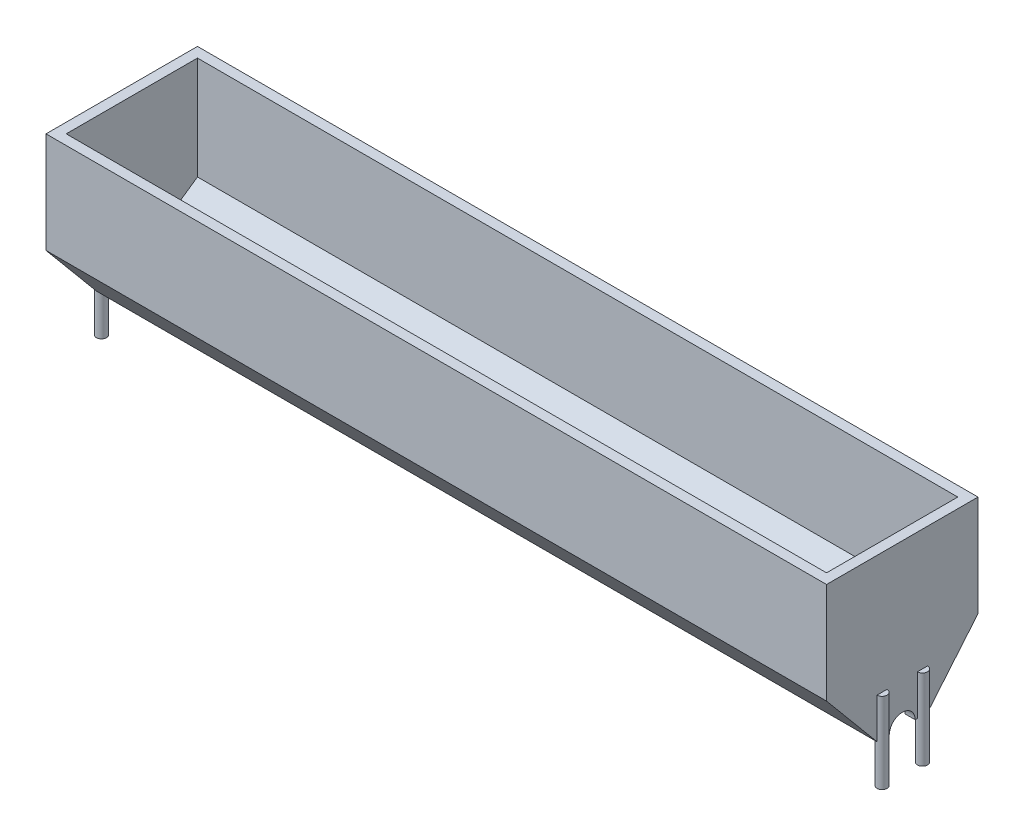
ISO-10303-21;
HEADER;
FILE_DESCRIPTION(('STEP AP214'),'2;1');
FILE_NAME('part.step','',(''),(''),'','','');
FILE_SCHEMA(('AUTOMOTIVE_DESIGN { 1 0 10303 214 1 1 1 1 }'));
ENDSEC;
DATA;
#1=APPLICATION_CONTEXT('core data for automotive mechanical design processes');
#2=APPLICATION_PROTOCOL_DEFINITION('international standard','automotive_design',2000,#1);
#3=PRODUCT_CONTEXT('',#1,'mechanical');
#4=PRODUCT('Part','Part','',(#3));
#5=PRODUCT_RELATED_PRODUCT_CATEGORY('part','',(#4));
#6=PRODUCT_DEFINITION_FORMATION('','',#4);
#7=PRODUCT_DEFINITION_CONTEXT('part definition',#1,'design');
#8=PRODUCT_DEFINITION('design','',#6,#7);
#9=PRODUCT_DEFINITION_SHAPE('','',#8);
#10=(LENGTH_UNIT() NAMED_UNIT(*) SI_UNIT(.MILLI.,.METRE.));
#11=(NAMED_UNIT(*) PLANE_ANGLE_UNIT() SI_UNIT($,.RADIAN.));
#12=(NAMED_UNIT(*) SI_UNIT($,.STERADIAN.) SOLID_ANGLE_UNIT());
#13=UNCERTAINTY_MEASURE_WITH_UNIT(LENGTH_MEASURE(1.E-05),#10,'distance_accuracy_value','');
#14=(GEOMETRIC_REPRESENTATION_CONTEXT(3) GLOBAL_UNCERTAINTY_ASSIGNED_CONTEXT((#13)) GLOBAL_UNIT_ASSIGNED_CONTEXT((#10,
#11,#12)) REPRESENTATION_CONTEXT('',''));
#15=CARTESIAN_POINT('',(0.,0.,0.));
#16=DIRECTION('',(0.,0.,1.));
#17=DIRECTION('',(1.,0.,0.));
#18=AXIS2_PLACEMENT_3D('',#15,#16,#17);
#19=CARTESIAN_POINT('',(0.,0.,0.));
#20=DIRECTION('',(-1.,0.,0.));
#21=DIRECTION('',(0.,0.,1.));
#22=AXIS2_PLACEMENT_3D('',#19,#20,#21);
#23=PLANE('',#22);
#24=CARTESIAN_POINT('',(0.,-27.9120185943422,0.));
#25=DIRECTION('',(-1.,0.,0.));
#26=DIRECTION('',(0.,0.,-1.));
#27=AXIS2_PLACEMENT_3D('',#24,#25,#26);
#28=CIRCLE('',#27,5.461);
#29=CARTESIAN_POINT('',(0.,-27.9120185943422,5.46099999999999));
#30=VERTEX_POINT('',#29);
#31=CARTESIAN_POINT('',(0.,-24.3378338958724,4.12888904443122));
#32=VERTEX_POINT('',#31);
#33=EDGE_CURVE('E259',#30,#32,#28,.T.);
#34=ORIENTED_EDGE('',*,*,#33,.T.);
#35=DIRECTION('',(0.,-0.570281057434681,-0.821449642723875));
#36=VECTOR('',#35,1.);
#37=CARTESIAN_POINT('',(0.,-18.3568794459747,12.7440321076022));
#38=LINE('',#37,#36);
#39=CARTESIAN_POINT('',(0.,-24.5592185943422,3.81000000000001));
#40=VERTEX_POINT('',#39);
#41=EDGE_CURVE('E327',#32,#40,#38,.T.);
#42=ORIENTED_EDGE('',*,*,#41,.T.);
#43=DIRECTION('',(0.,1.,0.));
#44=VECTOR('',#43,1.);
#45=CARTESIAN_POINT('',(0.,0.,3.81000000000001));
#46=LINE('',#45,#44);
#47=CARTESIAN_POINT('',(0.,-22.0192185943422,3.81000000000001));
#48=VERTEX_POINT('',#47);
#49=EDGE_CURVE('E323',#40,#48,#46,.T.);
#50=ORIENTED_EDGE('',*,*,#49,.T.);
#51=DIRECTION('',(0.,0.570281057434682,0.821449642723875));
#52=VECTOR('',#51,1.);
#53=CARTESIAN_POINT('',(0.,-16.6429394765255,11.5541508935622));
#54=LINE('',#53,#52);
#55=CARTESIAN_POINT('',(0.,-13.2024037188684,16.51));
#56=VERTEX_POINT('',#55);
#57=EDGE_CURVE('E319',#48,#56,#54,.T.);
#58=ORIENTED_EDGE('',*,*,#57,.T.);
#59=DIRECTION('',(0.,1.,0.));
#60=VECTOR('',#59,1.);
#61=CARTESIAN_POINT('',(0.,0.,16.51));
#62=LINE('',#61,#60);
#63=CARTESIAN_POINT('',(0.,12.7,16.51));
#64=VERTEX_POINT('',#63);
#65=EDGE_CURVE('E315',#56,#64,#62,.T.);
#66=ORIENTED_EDGE('',*,*,#65,.T.);
#67=DIRECTION('',(0.,0.,1.));
#68=VECTOR('',#67,1.);
#69=CARTESIAN_POINT('',(0.,12.7,19.05));
#70=LINE('',#69,#68);
#71=CARTESIAN_POINT('',(0.,12.7,-16.51));
#72=VERTEX_POINT('',#71);
#73=EDGE_CURVE('E277',#72,#64,#70,.T.);
#74=ORIENTED_EDGE('',*,*,#73,.F.);
#75=DIRECTION('',(0.,1.,0.));
#76=VECTOR('',#75,1.);
#77=CARTESIAN_POINT('',(0.,0.,-16.51));
#78=LINE('',#77,#76);
#79=CARTESIAN_POINT('',(0.,-13.2024037188684,-16.51));
#80=VERTEX_POINT('',#79);
#81=EDGE_CURVE('E311',#80,#72,#78,.T.);
#82=ORIENTED_EDGE('',*,*,#81,.F.);
#83=DIRECTION('',(0.,0.570281057434682,-0.821449642723875));
#84=VECTOR('',#83,1.);
#85=CARTESIAN_POINT('',(0.,-16.6429394765255,-11.5541508935622));
#86=LINE('',#85,#84);
#87=CARTESIAN_POINT('',(0.,-22.0192185943422,-3.81000000000001));
#88=VERTEX_POINT('',#87);
#89=EDGE_CURVE('E307',#88,#80,#86,.T.);
#90=ORIENTED_EDGE('',*,*,#89,.F.);
#91=DIRECTION('',(0.,1.,0.));
#92=VECTOR('',#91,1.);
#93=CARTESIAN_POINT('',(0.,0.,-3.81000000000001));
#94=LINE('',#93,#92);
#95=CARTESIAN_POINT('',(0.,-24.5592185943422,-3.81000000000001));
#96=VERTEX_POINT('',#95);
#97=EDGE_CURVE('E300',#96,#88,#94,.T.);
#98=ORIENTED_EDGE('',*,*,#97,.F.);
#99=DIRECTION('',(0.,-0.570281057434681,0.821449642723875));
#100=VECTOR('',#99,1.);
#101=CARTESIAN_POINT('',(0.,-18.3568794459747,-12.7440321076022));
#102=LINE('',#101,#100);
#103=CARTESIAN_POINT('',(0.,-24.3378338958724,-4.12888904443123));
#104=VERTEX_POINT('',#103);
#105=EDGE_CURVE('E304',#104,#96,#102,.T.);
#106=ORIENTED_EDGE('',*,*,#105,.F.);
#107=CARTESIAN_POINT('',(0.,-27.9120185943422,0.));
#108=DIRECTION('',(1.,0.,0.));
#109=DIRECTION('',(0.,0.,1.));
#110=AXIS2_PLACEMENT_3D('',#107,#108,#109);
#111=CIRCLE('',#110,5.461);
#112=CARTESIAN_POINT('',(0.,-27.9120185943422,-5.46099999999999));
#113=VERTEX_POINT('',#112);
#114=EDGE_CURVE('E71',#113,#104,#111,.T.);
#115=ORIENTED_EDGE('',*,*,#114,.F.);
#116=DIRECTION('',(0.,0.,-1.));
#117=VECTOR('',#116,1.);
#118=CARTESIAN_POINT('',(0.,-27.9120185943422,-6.34999999999999));
#119=LINE('',#118,#117);
#120=CARTESIAN_POINT('',(0.,-27.9120185943422,-3.23850000000001));
#121=VERTEX_POINT('',#120);
#122=EDGE_CURVE('E269',#121,#113,#119,.T.);
#123=ORIENTED_EDGE('',*,*,#122,.F.);
#124=CARTESIAN_POINT('',(0.,-27.9120185943422,0.));
#125=DIRECTION('',(-1.,0.,0.));
#126=DIRECTION('',(0.,0.,1.));
#127=AXIS2_PLACEMENT_3D('',#124,#125,#126);
#128=CIRCLE('',#127,3.2385);
#129=CARTESIAN_POINT('',(0.,-27.9120185943422,3.23850000000001));
#130=VERTEX_POINT('',#129);
#131=EDGE_CURVE('E266',#130,#121,#128,.T.);
#132=ORIENTED_EDGE('',*,*,#131,.F.);
#133=EDGE_CURVE('E248',#30,#130,#119,.T.);
#134=ORIENTED_EDGE('',*,*,#133,.F.);
#135=EDGE_LOOP('',(#34,#42,#50,#58,#66,#74,#82,#90,#98,#106,#115,#123,#132,#134));
#136=FACE_BOUND('',#135,.T.);
#137=ADVANCED_FACE('F55',(#136),#23,.T.);
#138=CARTESIAN_POINT('',(-193.802,-15.7424037188685,-16.51));
#139=DIRECTION('',(0.,-0.821449642723875,-0.570281057434681));
#140=DIRECTION('',(0.,0.570281057434681,-0.821449642723875));
#141=AXIS2_PLACEMENT_3D('',#138,#139,#140);
#142=PLANE('',#141);
#143=DIRECTION('',(0.,-0.570281057434681,0.821449642723875));
#144=VECTOR('',#143,1.);
#145=CARTESIAN_POINT('',(-191.262,-15.7424037188685,-16.51));
#146=LINE('',#145,#144);
#147=CARTESIAN_POINT('',(-191.262,-24.3378338958724,-4.12888904443123));
#148=VERTEX_POINT('',#147);
#149=CARTESIAN_POINT('',(-191.262,-24.5592185943422,-3.81000000000001));
#150=VERTEX_POINT('',#149);
#151=EDGE_CURVE('E487',#148,#150,#146,.T.);
#152=ORIENTED_EDGE('',*,*,#151,.F.);
#153=DIRECTION('',(1.,0.,0.));
#154=VECTOR('',#153,1.);
#155=CARTESIAN_POINT('',(-208.622628868548,-24.3378338958724,-4.12888904443123));
#156=LINE('',#155,#154);
#157=EDGE_CURVE('E79',#148,#104,#156,.T.);
#158=ORIENTED_EDGE('',*,*,#157,.T.);
#159=ORIENTED_EDGE('',*,*,#105,.T.);
#160=DIRECTION('',(1.,0.,0.));
#161=VECTOR('',#160,1.);
#162=CARTESIAN_POINT('',(-193.802,-24.5592185943422,-3.81000000000001));
#163=LINE('',#162,#161);
#164=EDGE_CURVE('E538',#150,#96,#163,.T.);
#165=ORIENTED_EDGE('',*,*,#164,.F.);
#166=EDGE_LOOP('',(#152,#158,#159,#165));
#167=FACE_BOUND('',#166,.T.);
#168=ADVANCED_FACE('F719',(#167),#142,.T.);
#169=CARTESIAN_POINT('',(-191.262,0.,0.));
#170=DIRECTION('',(1.,0.,0.));
#171=DIRECTION('',(0.,0.,1.));
#172=AXIS2_PLACEMENT_3D('',#169,#170,#171);
#173=PLANE('',#172);
#174=CARTESIAN_POINT('',(-191.262,-27.9120185943422,0.));
#175=DIRECTION('',(1.,0.,0.));
#176=DIRECTION('',(0.,0.,-1.));
#177=AXIS2_PLACEMENT_3D('',#174,#175,#176);
#178=CIRCLE('',#177,5.461);
#179=CARTESIAN_POINT('',(-191.262,-24.3378338958724,4.12888904443122));
#180=VERTEX_POINT('',#179);
#181=CARTESIAN_POINT('',(-191.262,-27.9120185943422,5.46099999999999));
#182=VERTEX_POINT('',#181);
#183=EDGE_CURVE('E255',#180,#182,#178,.T.);
#184=ORIENTED_EDGE('',*,*,#183,.T.);
#185=DIRECTION('',(0.,0.,-1.));
#186=VECTOR('',#185,1.);
#187=CARTESIAN_POINT('',(-191.262,-27.9120185943422,-6.34999999999999));
#188=LINE('',#187,#186);
#189=CARTESIAN_POINT('',(-191.262,-27.9120185943422,3.23850000000001));
#190=VERTEX_POINT('',#189);
#191=EDGE_CURVE('E251',#182,#190,#188,.T.);
#192=ORIENTED_EDGE('',*,*,#191,.T.);
#193=CARTESIAN_POINT('',(-191.262,-27.9120185943422,0.));
#194=DIRECTION('',(1.,0.,0.));
#195=DIRECTION('',(0.,0.,-1.));
#196=AXIS2_PLACEMENT_3D('',#193,#194,#195);
#197=CIRCLE('',#196,3.2385);
#198=CARTESIAN_POINT('',(-191.262,-27.9120185943422,-3.23850000000001));
#199=VERTEX_POINT('',#198);
#200=EDGE_CURVE('E445',#199,#190,#197,.T.);
#201=ORIENTED_EDGE('',*,*,#200,.F.);
#202=CARTESIAN_POINT('',(-191.262,-27.9120185943422,-5.46099999999999));
#203=VERTEX_POINT('',#202);
#204=EDGE_CURVE('E462',#199,#203,#188,.T.);
#205=ORIENTED_EDGE('',*,*,#204,.T.);
#206=CARTESIAN_POINT('',(-191.262,-27.9120185943422,0.));
#207=DIRECTION('',(1.,0.,0.));
#208=DIRECTION('',(0.,0.,-1.));
#209=AXIS2_PLACEMENT_3D('',#206,#207,#208);
#210=CIRCLE('',#209,5.461);
#211=EDGE_CURVE('E401',#148,#203,#210,.F.);
#212=ORIENTED_EDGE('',*,*,#211,.F.);
#213=ORIENTED_EDGE('',*,*,#151,.T.);
#214=DIRECTION('',(0.,1.,0.));
#215=VECTOR('',#214,1.);
#216=CARTESIAN_POINT('',(-191.262,-24.5592185943422,-3.81000000000001));
#217=LINE('',#216,#215);
#218=CARTESIAN_POINT('',(-191.262,-22.0192185943422,-3.81000000000001));
#219=VERTEX_POINT('',#218);
#220=EDGE_CURVE('E483',#150,#219,#217,.T.);
#221=ORIENTED_EDGE('',*,*,#220,.T.);
#222=DIRECTION('',(0.,0.570281057434682,-0.821449642723875));
#223=VECTOR('',#222,1.);
#224=CARTESIAN_POINT('',(-191.262,-22.0192185943422,-3.81000000000001));
#225=LINE('',#224,#223);
#226=CARTESIAN_POINT('',(-191.262,-13.2024037188684,-16.51));
#227=VERTEX_POINT('',#226);
#228=EDGE_CURVE('E490',#219,#227,#225,.T.);
#229=ORIENTED_EDGE('',*,*,#228,.T.);
#230=DIRECTION('',(0.,1.,0.));
#231=VECTOR('',#230,1.);
#232=CARTESIAN_POINT('',(-191.262,-13.2024037188684,-16.51));
#233=LINE('',#232,#231);
#234=CARTESIAN_POINT('',(-191.262,12.7,-16.51));
#235=VERTEX_POINT('',#234);
#236=EDGE_CURVE('E494',#227,#235,#233,.T.);
#237=ORIENTED_EDGE('',*,*,#236,.T.);
#238=DIRECTION('',(0.,0.,1.));
#239=VECTOR('',#238,1.);
#240=CARTESIAN_POINT('',(-191.262,12.7,19.05));
#241=LINE('',#240,#239);
#242=CARTESIAN_POINT('',(-191.262,12.7,16.51));
#243=VERTEX_POINT('',#242);
#244=EDGE_CURVE('E470',#235,#243,#241,.T.);
#245=ORIENTED_EDGE('',*,*,#244,.T.);
#246=DIRECTION('',(0.,1.,0.));
#247=VECTOR('',#246,1.);
#248=CARTESIAN_POINT('',(-191.262,-13.2024037188684,16.51));
#249=LINE('',#248,#247);
#250=CARTESIAN_POINT('',(-191.262,-13.2024037188684,16.51));
#251=VERTEX_POINT('',#250);
#252=EDGE_CURVE('E330',#251,#243,#249,.T.);
#253=ORIENTED_EDGE('',*,*,#252,.F.);
#254=DIRECTION('',(0.,0.570281057434682,0.821449642723875));
#255=VECTOR('',#254,1.);
#256=CARTESIAN_POINT('',(-191.262,-22.0192185943422,3.81000000000001));
#257=LINE('',#256,#255);
#258=CARTESIAN_POINT('',(-191.262,-22.0192185943422,3.81000000000001));
#259=VERTEX_POINT('',#258);
#260=EDGE_CURVE('E466',#259,#251,#257,.T.);
#261=ORIENTED_EDGE('',*,*,#260,.F.);
#262=DIRECTION('',(0.,1.,0.));
#263=VECTOR('',#262,1.);
#264=CARTESIAN_POINT('',(-191.262,-24.5592185943422,3.81000000000001));
#265=LINE('',#264,#263);
#266=CARTESIAN_POINT('',(-191.262,-24.5592185943422,3.81000000000001));
#267=VERTEX_POINT('',#266);
#268=EDGE_CURVE('E476',#267,#259,#265,.T.);
#269=ORIENTED_EDGE('',*,*,#268,.F.);
#270=DIRECTION('',(0.,-0.570281057434681,-0.821449642723875));
#271=VECTOR('',#270,1.);
#272=CARTESIAN_POINT('',(-191.262,-15.7424037188685,16.51));
#273=LINE('',#272,#271);
#274=EDGE_CURVE('E480',#180,#267,#273,.T.);
#275=ORIENTED_EDGE('',*,*,#274,.F.);
#276=EDGE_LOOP('',(#184,#192,#201,#205,#212,#213,#221,#229,#237,#245,#253,#261,#269,#275));
#277=FACE_BOUND('',#276,.T.);
#278=ADVANCED_FACE('F644',(#277),#173,.T.);
#279=CARTESIAN_POINT('',(2.54,0.,0.));
#280=DIRECTION('',(-1.,0.,0.));
#281=DIRECTION('',(0.,0.,1.));
#282=AXIS2_PLACEMENT_3D('',#279,#280,#281);
#283=PLANE('',#282);
#284=DIRECTION('',(0.,-1.,0.));
#285=VECTOR('',#284,1.);
#286=CARTESIAN_POINT('',(2.54,-17.7520185943422,-6.34999999999999));
#287=LINE('',#286,#285);
#288=CARTESIAN_POINT('',(2.54,-27.9120185943422,-6.34999999999999));
#289=VERTEX_POINT('',#288);
#290=CARTESIAN_POINT('',(2.54,-17.7520185943422,-6.34999999999999));
#291=VERTEX_POINT('',#290);
#292=EDGE_CURVE('E13',#289,#291,#287,.F.);
#293=ORIENTED_EDGE('',*,*,#292,.F.);
#294=DIRECTION('',(0.,0.767642268057594,-0.640878575310013));
#295=VECTOR('',#294,1.);
#296=CARTESIAN_POINT('',(2.54,-12.7,-19.05));
#297=LINE('',#296,#295);
#298=CARTESIAN_POINT('',(2.54,-12.7,-19.05));
#299=VERTEX_POINT('',#298);
#300=EDGE_CURVE('E285',#289,#299,#297,.T.);
#301=ORIENTED_EDGE('',*,*,#300,.T.);
#302=DIRECTION('',(0.,1.,0.));
#303=VECTOR('',#302,1.);
#304=CARTESIAN_POINT('',(2.54,-12.7,-19.05));
#305=LINE('',#304,#303);
#306=CARTESIAN_POINT('',(2.54,12.7,-19.05));
#307=VERTEX_POINT('',#306);
#308=EDGE_CURVE('E268',#299,#307,#305,.T.);
#309=ORIENTED_EDGE('',*,*,#308,.T.);
#310=DIRECTION('',(0.,0.,1.));
#311=VECTOR('',#310,1.);
#312=CARTESIAN_POINT('',(2.54,12.7,19.05));
#313=LINE('',#312,#311);
#314=CARTESIAN_POINT('',(2.54,12.7,19.05));
#315=VERTEX_POINT('',#314);
#316=EDGE_CURVE('E275',#307,#315,#313,.T.);
#317=ORIENTED_EDGE('',*,*,#316,.T.);
#318=DIRECTION('',(0.,-1.,0.));
#319=VECTOR('',#318,1.);
#320=CARTESIAN_POINT('',(2.54,-12.7,19.05));
#321=LINE('',#320,#319);
#322=CARTESIAN_POINT('',(2.54,-12.7,19.05));
#323=VERTEX_POINT('',#322);
#324=EDGE_CURVE('E546',#315,#323,#321,.T.);
#325=ORIENTED_EDGE('',*,*,#324,.T.);
#326=DIRECTION('',(0.,-0.767642268057595,-0.640878575310013));
#327=VECTOR('',#326,1.);
#328=CARTESIAN_POINT('',(2.54,-12.7,19.05));
#329=LINE('',#328,#327);
#330=CARTESIAN_POINT('',(2.54,-27.9120185943422,6.34999999999999));
#331=VERTEX_POINT('',#330);
#332=EDGE_CURVE('E549',#323,#331,#329,.T.);
#333=ORIENTED_EDGE('',*,*,#332,.T.);
#334=DIRECTION('',(0.,-1.,0.));
#335=VECTOR('',#334,1.);
#336=CARTESIAN_POINT('',(2.54,-17.7520185943422,6.34999999999999));
#337=LINE('',#336,#335);
#338=CARTESIAN_POINT('',(2.54,-17.7520185943422,6.34999999999999));
#339=VERTEX_POINT('',#338);
#340=EDGE_CURVE('E345',#331,#339,#337,.F.);
#341=ORIENTED_EDGE('',*,*,#340,.T.);
#342=DIRECTION('',(0.,0.,1.));
#343=VECTOR('',#342,1.);
#344=CARTESIAN_POINT('',(2.54,-17.7520185943422,0.));
#345=LINE('',#344,#343);
#346=CARTESIAN_POINT('',(2.54,-17.7520185943422,3.82721599375996));
#347=VERTEX_POINT('',#346);
#348=EDGE_CURVE('E341',#347,#339,#345,.T.);
#349=ORIENTED_EDGE('',*,*,#348,.F.);
#350=DIRECTION('',(0.,-1.,0.));
#351=VECTOR('',#350,1.);
#352=CARTESIAN_POINT('',(2.54,-17.7520185943422,3.82721599375996));
#353=LINE('',#352,#351);
#354=CARTESIAN_POINT('',(2.54,-27.9120185943422,3.82721599375996));
#355=VERTEX_POINT('',#354);
#356=EDGE_CURVE('E348',#347,#355,#353,.T.);
#357=ORIENTED_EDGE('',*,*,#356,.T.);
#358=DIRECTION('',(0.,0.,-1.));
#359=VECTOR('',#358,1.);
#360=CARTESIAN_POINT('',(2.54,-27.9120185943422,-6.34999999999999));
#361=LINE('',#360,#359);
#362=CARTESIAN_POINT('',(2.53999999999999,-27.9120185943422,3.23850000000001));
#363=VERTEX_POINT('',#362);
#364=EDGE_CURVE('E553',#355,#363,#361,.T.);
#365=ORIENTED_EDGE('',*,*,#364,.T.);
#366=CARTESIAN_POINT('',(2.53999999999999,-27.9120185943422,0.));
#367=DIRECTION('',(-1.,0.,0.));
#368=DIRECTION('',(0.,0.,1.));
#369=AXIS2_PLACEMENT_3D('',#366,#367,#368);
#370=CIRCLE('',#369,3.2385);
#371=CARTESIAN_POINT('',(2.54,-27.9120185943422,-3.23850000000001));
#372=VERTEX_POINT('',#371);
#373=EDGE_CURVE('E442',#363,#372,#370,.T.);
#374=ORIENTED_EDGE('',*,*,#373,.T.);
#375=CARTESIAN_POINT('',(2.54,-27.9120185943422,-3.82721599375996));
#376=VERTEX_POINT('',#375);
#377=EDGE_CURVE('E389',#372,#376,#361,.T.);
#378=ORIENTED_EDGE('',*,*,#377,.T.);
#379=DIRECTION('',(0.,-1.,0.));
#380=VECTOR('',#379,1.);
#381=CARTESIAN_POINT('',(2.54,-17.7520185943422,-3.82721599375996));
#382=LINE('',#381,#380);
#383=CARTESIAN_POINT('',(2.54,-17.7520185943422,-3.82721599375996));
#384=VERTEX_POINT('',#383);
#385=EDGE_CURVE('E64',#384,#376,#382,.T.);
#386=ORIENTED_EDGE('',*,*,#385,.F.);
#387=DIRECTION('',(0.,0.,1.));
#388=VECTOR('',#387,1.);
#389=CARTESIAN_POINT('',(2.54,-17.7520185943422,0.));
#390=LINE('',#389,#388);
#391=EDGE_CURVE('E371',#291,#384,#390,.T.);
#392=ORIENTED_EDGE('',*,*,#391,.F.);
#393=EDGE_LOOP('',(#293,#301,#309,#317,#325,#333,#341,#349,#357,#365,#374,#378,#386,#392));
#394=FACE_BOUND('',#393,.T.);
#395=ADVANCED_FACE('F386',(#394),#283,.F.);
#396=CARTESIAN_POINT('',(-193.802,0.,0.));
#397=DIRECTION('',(1.,0.,0.));
#398=DIRECTION('',(0.,0.,-1.));
#399=AXIS2_PLACEMENT_3D('',#396,#397,#398);
#400=PLANE('',#399);
#401=DIRECTION('',(0.,0.,-1.));
#402=VECTOR('',#401,1.);
#403=CARTESIAN_POINT('',(-193.802,-17.7520185943422,0.));
#404=LINE('',#403,#402);
#405=CARTESIAN_POINT('',(-193.802,-17.7520185943422,-3.82721599375996));
#406=VERTEX_POINT('',#405);
#407=CARTESIAN_POINT('',(-193.802,-17.7520185943422,-6.34999999999999));
#408=VERTEX_POINT('',#407);
#409=EDGE_CURVE('E367',#406,#408,#404,.T.);
#410=ORIENTED_EDGE('',*,*,#409,.F.);
#411=DIRECTION('',(0.,-1.,0.));
#412=VECTOR('',#411,1.);
#413=CARTESIAN_POINT('',(-193.802,-17.7520185943422,-3.82721599375996));
#414=LINE('',#413,#412);
#415=CARTESIAN_POINT('',(-193.802,-27.9120185943422,-3.82721599375996));
#416=VERTEX_POINT('',#415);
#417=EDGE_CURVE('E416',#406,#416,#414,.T.);
#418=ORIENTED_EDGE('',*,*,#417,.T.);
#419=DIRECTION('',(0.,0.,-1.));
#420=VECTOR('',#419,1.);
#421=CARTESIAN_POINT('',(-193.802,-27.9120185943422,-6.34999999999999));
#422=LINE('',#421,#420);
#423=CARTESIAN_POINT('',(-193.802,-27.9120185943422,-3.23850000000001));
#424=VERTEX_POINT('',#423);
#425=EDGE_CURVE('E467',#424,#416,#422,.T.);
#426=ORIENTED_EDGE('',*,*,#425,.F.);
#427=CARTESIAN_POINT('',(-193.802,-27.9120185943422,0.));
#428=DIRECTION('',(1.,0.,0.));
#429=DIRECTION('',(0.,0.,-1.));
#430=AXIS2_PLACEMENT_3D('',#427,#428,#429);
#431=CIRCLE('',#430,3.2385);
#432=CARTESIAN_POINT('',(-193.802,-27.9120185943422,3.23850000000001));
#433=VERTEX_POINT('',#432);
#434=EDGE_CURVE('E449',#424,#433,#431,.T.);
#435=ORIENTED_EDGE('',*,*,#434,.T.);
#436=CARTESIAN_POINT('',(-193.802,-27.9120185943422,3.82721599375996));
#437=VERTEX_POINT('',#436);
#438=EDGE_CURVE('E463',#437,#433,#422,.T.);
#439=ORIENTED_EDGE('',*,*,#438,.F.);
#440=DIRECTION('',(0.,-1.,0.));
#441=VECTOR('',#440,1.);
#442=CARTESIAN_POINT('',(-193.802,-17.7520185943422,3.82721599375996));
#443=LINE('',#442,#441);
#444=CARTESIAN_POINT('',(-193.802,-17.7520185943422,3.82721599375996));
#445=VERTEX_POINT('',#444);
#446=EDGE_CURVE('E355',#445,#437,#443,.T.);
#447=ORIENTED_EDGE('',*,*,#446,.F.);
#448=DIRECTION('',(0.,0.,-1.));
#449=VECTOR('',#448,1.);
#450=CARTESIAN_POINT('',(-193.802,-17.7520185943422,0.));
#451=LINE('',#450,#449);
#452=CARTESIAN_POINT('',(-193.802,-17.7520185943422,6.34999999999999));
#453=VERTEX_POINT('',#452);
#454=EDGE_CURVE('E351',#453,#445,#451,.T.);
#455=ORIENTED_EDGE('',*,*,#454,.F.);
#456=DIRECTION('',(0.,-1.,0.));
#457=VECTOR('',#456,1.);
#458=CARTESIAN_POINT('',(-193.802,-17.7520185943422,6.34999999999999));
#459=LINE('',#458,#457);
#460=CARTESIAN_POINT('',(-193.802,-27.9120185943422,6.34999999999999));
#461=VERTEX_POINT('',#460);
#462=EDGE_CURVE('E359',#461,#453,#459,.F.);
#463=ORIENTED_EDGE('',*,*,#462,.F.);
#464=DIRECTION('',(0.,0.767642268057595,0.640878575310013));
#465=VECTOR('',#464,1.);
#466=CARTESIAN_POINT('',(-193.802,-15.7424037188685,16.51));
#467=LINE('',#466,#465);
#468=CARTESIAN_POINT('',(-193.802,-12.7,19.05));
#469=VERTEX_POINT('',#468);
#470=EDGE_CURVE('E502',#461,#469,#467,.T.);
#471=ORIENTED_EDGE('',*,*,#470,.T.);
#472=DIRECTION('',(0.,1.,0.));
#473=VECTOR('',#472,1.);
#474=CARTESIAN_POINT('',(-193.802,12.7,19.05));
#475=LINE('',#474,#473);
#476=CARTESIAN_POINT('',(-193.802,12.7,19.05));
#477=VERTEX_POINT('',#476);
#478=EDGE_CURVE('E498',#469,#477,#475,.T.);
#479=ORIENTED_EDGE('',*,*,#478,.T.);
#480=DIRECTION('',(0.,0.,1.));
#481=VECTOR('',#480,1.);
#482=CARTESIAN_POINT('',(-193.802,12.7,-16.51));
#483=LINE('',#482,#481);
#484=CARTESIAN_POINT('',(-193.802,12.7,-19.05));
#485=VERTEX_POINT('',#484);
#486=EDGE_CURVE('E527',#485,#477,#483,.T.);
#487=ORIENTED_EDGE('',*,*,#486,.F.);
#488=DIRECTION('',(0.,1.,0.));
#489=VECTOR('',#488,1.);
#490=CARTESIAN_POINT('',(-193.802,12.7,-19.05));
#491=LINE('',#490,#489);
#492=CARTESIAN_POINT('',(-193.802,-12.7,-19.05));
#493=VERTEX_POINT('',#492);
#494=EDGE_CURVE('E523',#493,#485,#491,.T.);
#495=ORIENTED_EDGE('',*,*,#494,.F.);
#496=DIRECTION('',(0.,0.767642268057595,-0.640878575310013));
#497=VECTOR('',#496,1.);
#498=CARTESIAN_POINT('',(-193.802,-15.7424037188685,-16.51));
#499=LINE('',#498,#497);
#500=CARTESIAN_POINT('',(-193.802,-27.9120185943422,-6.34999999999999));
#501=VERTEX_POINT('',#500);
#502=EDGE_CURVE('E510',#501,#493,#499,.T.);
#503=ORIENTED_EDGE('',*,*,#502,.F.);
#504=DIRECTION('',(0.,-1.,0.));
#505=VECTOR('',#504,1.);
#506=CARTESIAN_POINT('',(-193.802,-17.7520185943422,-6.34999999999999));
#507=LINE('',#506,#505);
#508=EDGE_CURVE('E410',#501,#408,#507,.F.);
#509=ORIENTED_EDGE('',*,*,#508,.T.);
#510=EDGE_LOOP('',(#410,#418,#426,#435,#439,#447,#455,#463,#471,#479,#487,#495,#503,#509));
#511=FACE_BOUND('',#510,.T.);
#512=ADVANCED_FACE('F572',(#511),#400,.F.);
#513=CARTESIAN_POINT('',(2.54,-12.7,-19.05));
#514=DIRECTION('',(0.,0.,1.));
#515=DIRECTION('',(1.,0.,0.));
#516=AXIS2_PLACEMENT_3D('',#513,#514,#515);
#517=PLANE('',#516);
#518=DIRECTION('',(-1.,0.,0.));
#519=VECTOR('',#518,1.);
#520=CARTESIAN_POINT('',(2.54,-12.7,-19.05));
#521=LINE('',#520,#519);
#522=EDGE_CURVE('E281',#299,#493,#521,.T.);
#523=ORIENTED_EDGE('',*,*,#522,.T.);
#524=ORIENTED_EDGE('',*,*,#494,.T.);
#525=DIRECTION('',(-1.,0.,0.));
#526=VECTOR('',#525,1.);
#527=CARTESIAN_POINT('',(2.54,12.7,-19.05));
#528=LINE('',#527,#526);
#529=EDGE_CURVE('E297',#307,#485,#528,.T.);
#530=ORIENTED_EDGE('',*,*,#529,.F.);
#531=ORIENTED_EDGE('',*,*,#308,.F.);
#532=EDGE_LOOP('',(#523,#524,#530,#531));
#533=FACE_BOUND('',#532,.T.);
#534=ADVANCED_FACE('F57',(#533),#517,.F.);
#535=CARTESIAN_POINT('',(2.54,12.7,19.05));
#536=DIRECTION('',(0.,-1.,0.));
#537=DIRECTION('',(0.,0.,-1.));
#538=AXIS2_PLACEMENT_3D('',#535,#536,#537);
#539=PLANE('',#538);
#540=ORIENTED_EDGE('',*,*,#244,.F.);
#541=DIRECTION('',(1.,0.,0.));
#542=VECTOR('',#541,1.);
#543=CARTESIAN_POINT('',(-193.802,12.7,-16.51));
#544=LINE('',#543,#542);
#545=EDGE_CURVE('E535',#235,#72,#544,.T.);
#546=ORIENTED_EDGE('',*,*,#545,.T.);
#547=ORIENTED_EDGE('',*,*,#73,.T.);
#548=DIRECTION('',(1.,0.,0.));
#549=VECTOR('',#548,1.);
#550=CARTESIAN_POINT('',(-193.802,12.7,16.51));
#551=LINE('',#550,#549);
#552=EDGE_CURVE('E515',#243,#64,#551,.T.);
#553=ORIENTED_EDGE('',*,*,#552,.F.);
#554=EDGE_LOOP('',(#540,#546,#547,#553));
#555=FACE_BOUND('',#554,.T.);
#556=ORIENTED_EDGE('',*,*,#529,.T.);
#557=ORIENTED_EDGE('',*,*,#486,.T.);
#558=DIRECTION('',(-1.,0.,0.));
#559=VECTOR('',#558,1.);
#560=CARTESIAN_POINT('',(2.54,12.7,19.05));
#561=LINE('',#560,#559);
#562=EDGE_CURVE('E294',#315,#477,#561,.T.);
#563=ORIENTED_EDGE('',*,*,#562,.F.);
#564=ORIENTED_EDGE('',*,*,#316,.F.);
#565=EDGE_LOOP('',(#556,#557,#563,#564));
#566=FACE_BOUND('',#565,.T.);
#567=ADVANCED_FACE('F569',(#555,#566),#539,.F.);
#568=CARTESIAN_POINT('',(2.54,-12.7,19.05));
#569=DIRECTION('',(0.,0.,-1.));
#570=DIRECTION('',(-1.,0.,0.));
#571=AXIS2_PLACEMENT_3D('',#568,#569,#570);
#572=PLANE('',#571);
#573=ORIENTED_EDGE('',*,*,#562,.T.);
#574=ORIENTED_EDGE('',*,*,#478,.F.);
#575=DIRECTION('',(-1.,0.,0.));
#576=VECTOR('',#575,1.);
#577=CARTESIAN_POINT('',(2.54,-12.7,19.05));
#578=LINE('',#577,#576);
#579=EDGE_CURVE('E291',#323,#469,#578,.T.);
#580=ORIENTED_EDGE('',*,*,#579,.F.);
#581=ORIENTED_EDGE('',*,*,#324,.F.);
#582=EDGE_LOOP('',(#573,#574,#580,#581));
#583=FACE_BOUND('',#582,.T.);
#584=ADVANCED_FACE('F578',(#583),#572,.F.);
#585=CARTESIAN_POINT('',(2.54,-12.7,19.05));
#586=DIRECTION('',(0.,0.640878575310013,-0.767642268057595));
#587=DIRECTION('',(0.,0.767642268057595,0.640878575310013));
#588=AXIS2_PLACEMENT_3D('',#585,#586,#587);
#589=PLANE('',#588);
#590=ORIENTED_EDGE('',*,*,#470,.F.);
#591=DIRECTION('',(-1.,0.,0.));
#592=VECTOR('',#591,1.);
#593=CARTESIAN_POINT('',(2.54,-27.9120185943422,6.34999999999999));
#594=LINE('',#593,#592);
#595=EDGE_CURVE('E288',#331,#461,#594,.T.);
#596=ORIENTED_EDGE('',*,*,#595,.F.);
#597=ORIENTED_EDGE('',*,*,#332,.F.);
#598=ORIENTED_EDGE('',*,*,#579,.T.);
#599=EDGE_LOOP('',(#590,#596,#597,#598));
#600=FACE_BOUND('',#599,.T.);
#601=ADVANCED_FACE('F584',(#600),#589,.F.);
#602=CARTESIAN_POINT('',(2.54,-27.9120185943422,-6.34999999999999));
#603=DIRECTION('',(0.,1.,0.));
#604=DIRECTION('',(0.,0.,1.));
#605=AXIS2_PLACEMENT_3D('',#602,#603,#604);
#606=PLANE('',#605);
#607=ORIENTED_EDGE('',*,*,#364,.F.);
#608=CARTESIAN_POINT('',(2.54,-27.9120185943422,5.08860799687998));
#609=DIRECTION('',(0.,1.,0.));
#610=DIRECTION('',(0.,0.,1.));
#611=AXIS2_PLACEMENT_3D('',#608,#609,#610);
#612=CIRCLE('',#611,1.26139200312002);
#613=EDGE_CURVE('E436',#355,#331,#612,.T.);
#614=ORIENTED_EDGE('',*,*,#613,.T.);
#615=ORIENTED_EDGE('',*,*,#595,.T.);
#616=CARTESIAN_POINT('',(-193.802,-27.9120185943422,5.08860799687998));
#617=DIRECTION('',(0.,-1.,0.));
#618=DIRECTION('',(0.,0.,-1.));
#619=AXIS2_PLACEMENT_3D('',#616,#617,#618);
#620=CIRCLE('',#619,1.26139200312002);
#621=EDGE_CURVE('E425',#461,#437,#620,.F.);
#622=ORIENTED_EDGE('',*,*,#621,.T.);
#623=ORIENTED_EDGE('',*,*,#438,.T.);
#624=DIRECTION('',(-1.,0.,0.));
#625=VECTOR('',#624,1.);
#626=CARTESIAN_POINT('',(2.53999999999999,-27.9120185943422,3.23850000000001));
#627=LINE('',#626,#625);
#628=EDGE_CURVE('E337',#190,#433,#627,.T.);
#629=ORIENTED_EDGE('',*,*,#628,.F.);
#630=ORIENTED_EDGE('',*,*,#191,.F.);
#631=DIRECTION('',(1.,0.,0.));
#632=VECTOR('',#631,1.);
#633=CARTESIAN_POINT('',(-208.622628868548,-27.9120185943422,5.46099999999999));
#634=LINE('',#633,#632);
#635=EDGE_CURVE('E242',#182,#30,#634,.T.);
#636=ORIENTED_EDGE('',*,*,#635,.T.);
#637=ORIENTED_EDGE('',*,*,#133,.T.);
#638=DIRECTION('',(-1.,0.,0.));
#639=VECTOR('',#638,1.);
#640=CARTESIAN_POINT('',(2.53999999999999,-27.9120185943422,3.23850000000001));
#641=LINE('',#640,#639);
#642=EDGE_CURVE('E453',#130,#363,#641,.F.);
#643=ORIENTED_EDGE('',*,*,#642,.T.);
#644=EDGE_LOOP('',(#607,#614,#615,#622,#623,#629,#630,#636,#637,#643));
#645=FACE_BOUND('',#644,.T.);
#646=ADVANCED_FACE('F245',(#645),#606,.F.);
#647=CARTESIAN_POINT('',(2.54,-12.7,-19.05));
#648=DIRECTION('',(0.,0.640878575310013,0.767642268057595));
#649=DIRECTION('',(0.,-0.767642268057595,0.640878575310013));
#650=AXIS2_PLACEMENT_3D('',#647,#648,#649);
#651=PLANE('',#650);
#652=DIRECTION('',(-1.,0.,0.));
#653=VECTOR('',#652,1.);
#654=CARTESIAN_POINT('',(2.54,-27.9120185943422,-6.34999999999999));
#655=LINE('',#654,#653);
#656=EDGE_CURVE('E284',#289,#501,#655,.T.);
#657=ORIENTED_EDGE('',*,*,#656,.T.);
#658=ORIENTED_EDGE('',*,*,#502,.T.);
#659=ORIENTED_EDGE('',*,*,#522,.F.);
#660=ORIENTED_EDGE('',*,*,#300,.F.);
#661=EDGE_LOOP('',(#657,#658,#659,#660));
#662=FACE_BOUND('',#661,.T.);
#663=ADVANCED_FACE('F563',(#662),#651,.F.);
#664=CARTESIAN_POINT('',(-193.802,-22.0192185943422,-3.81000000000001));
#665=DIRECTION('',(0.,0.821449642723875,0.570281057434681));
#666=DIRECTION('',(0.,-0.570281057434682,0.821449642723875));
#667=AXIS2_PLACEMENT_3D('',#664,#665,#666);
#668=PLANE('',#667);
#669=ORIENTED_EDGE('',*,*,#228,.F.);
#670=DIRECTION('',(1.,0.,0.));
#671=VECTOR('',#670,1.);
#672=CARTESIAN_POINT('',(-193.802,-22.0192185943422,-3.81000000000001));
#673=LINE('',#672,#671);
#674=EDGE_CURVE('E531',#219,#88,#673,.T.);
#675=ORIENTED_EDGE('',*,*,#674,.T.);
#676=ORIENTED_EDGE('',*,*,#89,.T.);
#677=DIRECTION('',(1.,0.,0.));
#678=VECTOR('',#677,1.);
#679=CARTESIAN_POINT('',(-193.802,-13.2024037188684,-16.51));
#680=LINE('',#679,#678);
#681=EDGE_CURVE('E532',#227,#80,#680,.T.);
#682=ORIENTED_EDGE('',*,*,#681,.F.);
#683=EDGE_LOOP('',(#669,#675,#676,#682));
#684=FACE_BOUND('',#683,.T.);
#685=ADVANCED_FACE('F713',(#684),#668,.T.);
#686=CARTESIAN_POINT('',(-193.802,-13.2024037188684,-16.51));
#687=DIRECTION('',(0.,0.,1.));
#688=DIRECTION('',(1.,0.,0.));
#689=AXIS2_PLACEMENT_3D('',#686,#687,#688);
#690=PLANE('',#689);
#691=ORIENTED_EDGE('',*,*,#236,.F.);
#692=ORIENTED_EDGE('',*,*,#681,.T.);
#693=ORIENTED_EDGE('',*,*,#81,.T.);
#694=ORIENTED_EDGE('',*,*,#545,.F.);
#695=EDGE_LOOP('',(#691,#692,#693,#694));
#696=FACE_BOUND('',#695,.T.);
#697=ADVANCED_FACE('F708',(#696),#690,.T.);
#698=CARTESIAN_POINT('',(-193.802,-24.5592185943422,-3.81000000000001));
#699=DIRECTION('',(0.,0.,1.));
#700=DIRECTION('',(1.,0.,0.));
#701=AXIS2_PLACEMENT_3D('',#698,#699,#700);
#702=PLANE('',#701);
#703=ORIENTED_EDGE('',*,*,#220,.F.);
#704=ORIENTED_EDGE('',*,*,#164,.T.);
#705=ORIENTED_EDGE('',*,*,#97,.T.);
#706=ORIENTED_EDGE('',*,*,#674,.F.);
#707=EDGE_LOOP('',(#703,#704,#705,#706));
#708=FACE_BOUND('',#707,.T.);
#709=ADVANCED_FACE('F717',(#708),#702,.T.);
#710=CARTESIAN_POINT('',(-193.802,-22.0192185943422,3.81000000000001));
#711=DIRECTION('',(0.,-0.821449642723875,0.570281057434681));
#712=DIRECTION('',(0.,-0.570281057434682,-0.821449642723875));
#713=AXIS2_PLACEMENT_3D('',#710,#711,#712);
#714=PLANE('',#713);
#715=DIRECTION('',(1.,0.,0.));
#716=VECTOR('',#715,1.);
#717=CARTESIAN_POINT('',(-193.802,-22.0192185943422,3.81000000000001));
#718=LINE('',#717,#716);
#719=EDGE_CURVE('E507',#259,#48,#718,.T.);
#720=ORIENTED_EDGE('',*,*,#719,.F.);
#721=ORIENTED_EDGE('',*,*,#260,.T.);
#722=DIRECTION('',(1.,0.,0.));
#723=VECTOR('',#722,1.);
#724=CARTESIAN_POINT('',(-193.802,-13.2024037188684,16.51));
#725=LINE('',#724,#723);
#726=EDGE_CURVE('E506',#251,#56,#725,.T.);
#727=ORIENTED_EDGE('',*,*,#726,.T.);
#728=ORIENTED_EDGE('',*,*,#57,.F.);
#729=EDGE_LOOP('',(#720,#721,#727,#728));
#730=FACE_BOUND('',#729,.T.);
#731=ADVANCED_FACE('F673',(#730),#714,.F.);
#732=CARTESIAN_POINT('',(-193.802,-24.5592185943422,3.81000000000001));
#733=DIRECTION('',(0.,0.,1.));
#734=DIRECTION('',(1.,0.,0.));
#735=AXIS2_PLACEMENT_3D('',#732,#733,#734);
#736=PLANE('',#735);
#737=DIRECTION('',(1.,0.,0.));
#738=VECTOR('',#737,1.);
#739=CARTESIAN_POINT('',(-193.802,-24.5592185943422,3.81000000000001));
#740=LINE('',#739,#738);
#741=EDGE_CURVE('E511',#267,#40,#740,.T.);
#742=ORIENTED_EDGE('',*,*,#741,.F.);
#743=ORIENTED_EDGE('',*,*,#268,.T.);
#744=ORIENTED_EDGE('',*,*,#719,.T.);
#745=ORIENTED_EDGE('',*,*,#49,.F.);
#746=EDGE_LOOP('',(#742,#743,#744,#745));
#747=FACE_BOUND('',#746,.T.);
#748=ADVANCED_FACE('F670',(#747),#736,.F.);
#749=CARTESIAN_POINT('',(-193.802,-15.7424037188685,16.51));
#750=DIRECTION('',(0.,0.821449642723875,-0.570281057434681));
#751=DIRECTION('',(0.,0.570281057434681,0.821449642723875));
#752=AXIS2_PLACEMENT_3D('',#749,#750,#751);
#753=PLANE('',#752);
#754=ORIENTED_EDGE('',*,*,#41,.F.);
#755=DIRECTION('',(1.,0.,0.));
#756=VECTOR('',#755,1.);
#757=CARTESIAN_POINT('',(-208.622628868548,-24.3378338958724,4.12888904443122));
#758=LINE('',#757,#756);
#759=EDGE_CURVE('E256',#180,#32,#758,.T.);
#760=ORIENTED_EDGE('',*,*,#759,.F.);
#761=ORIENTED_EDGE('',*,*,#274,.T.);
#762=ORIENTED_EDGE('',*,*,#741,.T.);
#763=EDGE_LOOP('',(#754,#760,#761,#762));
#764=FACE_BOUND('',#763,.T.);
#765=ADVANCED_FACE('F665',(#764),#753,.F.);
#766=CARTESIAN_POINT('',(-193.802,-13.2024037188684,16.51));
#767=DIRECTION('',(0.,0.,1.));
#768=DIRECTION('',(1.,0.,0.));
#769=AXIS2_PLACEMENT_3D('',#766,#767,#768);
#770=PLANE('',#769);
#771=ORIENTED_EDGE('',*,*,#726,.F.);
#772=ORIENTED_EDGE('',*,*,#252,.T.);
#773=ORIENTED_EDGE('',*,*,#552,.T.);
#774=ORIENTED_EDGE('',*,*,#65,.F.);
#775=EDGE_LOOP('',(#771,#772,#773,#774));
#776=FACE_BOUND('',#775,.T.);
#777=ADVANCED_FACE('F677',(#776),#770,.F.);
#778=CARTESIAN_POINT('',(-193.802,-27.9120185943422,-6.34999999999999));
#779=DIRECTION('',(0.,-1.,0.));
#780=DIRECTION('',(0.,0.,-1.));
#781=AXIS2_PLACEMENT_3D('',#778,#779,#780);
#782=PLANE('',#781);
#783=CARTESIAN_POINT('',(-193.802,-27.9120185943422,-5.08860799687999));
#784=DIRECTION('',(0.,-1.,0.));
#785=DIRECTION('',(0.,0.,-1.));
#786=AXIS2_PLACEMENT_3D('',#783,#784,#785);
#787=CIRCLE('',#786,1.26139200312002);
#788=EDGE_CURVE('E363',#501,#416,#787,.T.);
#789=ORIENTED_EDGE('',*,*,#788,.F.);
#790=ORIENTED_EDGE('',*,*,#656,.F.);
#791=CARTESIAN_POINT('',(2.54,-27.9120185943422,-5.08860799687999));
#792=DIRECTION('',(0.,1.,0.));
#793=DIRECTION('',(0.,0.,1.));
#794=AXIS2_PLACEMENT_3D('',#791,#792,#793);
#795=CIRCLE('',#794,1.26139200312002);
#796=EDGE_CURVE('E381',#376,#289,#795,.F.);
#797=ORIENTED_EDGE('',*,*,#796,.F.);
#798=ORIENTED_EDGE('',*,*,#377,.F.);
#799=DIRECTION('',(-1.,0.,0.));
#800=VECTOR('',#799,1.);
#801=CARTESIAN_POINT('',(2.53999999999999,-27.9120185943422,-3.23850000000001));
#802=LINE('',#801,#800);
#803=EDGE_CURVE('E458',#372,#121,#802,.T.);
#804=ORIENTED_EDGE('',*,*,#803,.T.);
#805=ORIENTED_EDGE('',*,*,#122,.T.);
#806=DIRECTION('',(1.,0.,0.));
#807=VECTOR('',#806,1.);
#808=CARTESIAN_POINT('',(-208.622628868548,-27.9120185943422,-5.46099999999999));
#809=LINE('',#808,#807);
#810=EDGE_CURVE('E649',#203,#113,#809,.T.);
#811=ORIENTED_EDGE('',*,*,#810,.F.);
#812=ORIENTED_EDGE('',*,*,#204,.F.);
#813=DIRECTION('',(-1.,0.,0.));
#814=VECTOR('',#813,1.);
#815=CARTESIAN_POINT('',(2.53999999999999,-27.9120185943422,-3.23850000000001));
#816=LINE('',#815,#814);
#817=EDGE_CURVE('E334',#424,#199,#816,.F.);
#818=ORIENTED_EDGE('',*,*,#817,.F.);
#819=ORIENTED_EDGE('',*,*,#425,.T.);
#820=EDGE_LOOP('',(#789,#790,#797,#798,#804,#805,#811,#812,#818,#819));
#821=FACE_BOUND('',#820,.T.);
#822=ADVANCED_FACE('F598',(#821),#782,.T.);
#823=CARTESIAN_POINT('',(2.53999999999999,-27.9120185943422,0.));
#824=DIRECTION('',(-1.,0.,0.));
#825=DIRECTION('',(0.,0.,1.));
#826=AXIS2_PLACEMENT_3D('',#823,#824,#825);
#827=CYLINDRICAL_SURFACE('',#826,3.2385);
#828=ORIENTED_EDGE('',*,*,#628,.T.);
#829=ORIENTED_EDGE('',*,*,#434,.F.);
#830=ORIENTED_EDGE('',*,*,#817,.T.);
#831=ORIENTED_EDGE('',*,*,#200,.T.);
#832=EDGE_LOOP('',(#828,#829,#830,#831));
#833=FACE_BOUND('',#832,.T.);
#834=ADVANCED_FACE('F763',(#833),#827,.F.);
#835=ORIENTED_EDGE('',*,*,#373,.F.);
#836=ORIENTED_EDGE('',*,*,#642,.F.);
#837=ORIENTED_EDGE('',*,*,#131,.T.);
#838=ORIENTED_EDGE('',*,*,#803,.F.);
#839=EDGE_LOOP('',(#835,#836,#837,#838));
#840=FACE_BOUND('',#839,.T.);
#841=ADVANCED_FACE('F595',(#840),#827,.F.);
#842=CARTESIAN_POINT('',(2.54,-17.7520185943422,5.08860799687998));
#843=DIRECTION('',(0.,-1.,0.));
#844=DIRECTION('',(0.,0.,-1.));
#845=AXIS2_PLACEMENT_3D('',#842,#843,#844);
#846=CYLINDRICAL_SURFACE('',#845,1.26139200312002);
#847=CARTESIAN_POINT('',(2.54,-38.0720185943422,5.08860799687998));
#848=DIRECTION('',(0.,-1.,0.));
#849=DIRECTION('',(0.,0.,-1.));
#850=AXIS2_PLACEMENT_3D('',#847,#848,#849);
#851=CIRCLE('',#850,1.26139200312002);
#852=CARTESIAN_POINT('',(2.54,-38.0720185943422,3.82721599375996));
#853=VERTEX_POINT('',#852);
#854=EDGE_CURVE('E431',#853,#853,#851,.T.);
#855=ORIENTED_EDGE('',*,*,#854,.F.);
#856=EDGE_LOOP('',(#855));
#857=FACE_BOUND('',#856,.T.);
#858=ORIENTED_EDGE('',*,*,#356,.F.);
#859=CARTESIAN_POINT('',(2.54,-17.7520185943422,5.08860799687998));
#860=DIRECTION('',(0.,-1.,0.));
#861=DIRECTION('',(0.,0.,-1.));
#862=AXIS2_PLACEMENT_3D('',#859,#860,#861);
#863=CIRCLE('',#862,1.26139200312002);
#864=EDGE_CURVE('E432',#347,#339,#863,.T.);
#865=ORIENTED_EDGE('',*,*,#864,.T.);
#866=ORIENTED_EDGE('',*,*,#340,.F.);
#867=ORIENTED_EDGE('',*,*,#613,.F.);
#868=EDGE_LOOP('',(#858,#865,#866,#867));
#869=FACE_BOUND('',#868,.T.);
#870=ADVANCED_FACE('F589',(#857,#869),#846,.T.);
#871=CARTESIAN_POINT('',(2.54,-17.7520185943422,5.08860799687998));
#872=DIRECTION('',(0.,-1.,0.));
#873=DIRECTION('',(0.,0.,-1.));
#874=AXIS2_PLACEMENT_3D('',#871,#872,#873);
#875=PLANE('',#874);
#876=ORIENTED_EDGE('',*,*,#864,.F.);
#877=ORIENTED_EDGE('',*,*,#348,.T.);
#878=EDGE_LOOP('',(#876,#877));
#879=FACE_BOUND('',#878,.T.);
#880=ADVANCED_FACE('F592',(#879),#875,.F.);
#881=CARTESIAN_POINT('',(2.54,-38.0720185943422,5.08860799687998));
#882=DIRECTION('',(0.,-1.,0.));
#883=DIRECTION('',(0.,0.,-1.));
#884=AXIS2_PLACEMENT_3D('',#881,#882,#883);
#885=PLANE('',#884);
#886=ORIENTED_EDGE('',*,*,#854,.T.);
#887=EDGE_LOOP('',(#886));
#888=FACE_BOUND('',#887,.T.);
#889=ADVANCED_FACE('F771',(#888),#885,.T.);
#890=CARTESIAN_POINT('',(-193.802,-17.7520185943422,5.08860799687998));
#891=DIRECTION('',(0.,-1.,0.));
#892=DIRECTION('',(0.,0.,-1.));
#893=AXIS2_PLACEMENT_3D('',#890,#891,#892);
#894=CYLINDRICAL_SURFACE('',#893,1.26139200312002);
#895=CARTESIAN_POINT('',(-193.802,-38.0720185943422,5.08860799687998));
#896=DIRECTION('',(0.,1.,0.));
#897=DIRECTION('',(0.,0.,-1.));
#898=AXIS2_PLACEMENT_3D('',#895,#896,#897);
#899=CIRCLE('',#898,1.26139200312002);
#900=CARTESIAN_POINT('',(-193.802,-38.0720185943422,3.82721599375996));
#901=VERTEX_POINT('',#900);
#902=EDGE_CURVE('E420',#901,#901,#899,.T.);
#903=ORIENTED_EDGE('',*,*,#902,.T.);
#904=EDGE_LOOP('',(#903));
#905=FACE_BOUND('',#904,.T.);
#906=ORIENTED_EDGE('',*,*,#621,.F.);
#907=ORIENTED_EDGE('',*,*,#462,.T.);
#908=CARTESIAN_POINT('',(-193.802,-17.7520185943422,5.08860799687998));
#909=DIRECTION('',(0.,1.,0.));
#910=DIRECTION('',(0.,0.,-1.));
#911=AXIS2_PLACEMENT_3D('',#908,#909,#910);
#912=CIRCLE('',#911,1.26139200312002);
#913=EDGE_CURVE('E421',#445,#453,#912,.T.);
#914=ORIENTED_EDGE('',*,*,#913,.F.);
#915=ORIENTED_EDGE('',*,*,#446,.T.);
#916=EDGE_LOOP('',(#906,#907,#914,#915));
#917=FACE_BOUND('',#916,.T.);
#918=ADVANCED_FACE('F774',(#905,#917),#894,.T.);
#919=CARTESIAN_POINT('',(-193.802,-17.7520185943422,5.08860799687998));
#920=DIRECTION('',(0.,-1.,0.));
#921=DIRECTION('',(0.,0.,-1.));
#922=AXIS2_PLACEMENT_3D('',#919,#920,#921);
#923=PLANE('',#922);
#924=ORIENTED_EDGE('',*,*,#913,.T.);
#925=ORIENTED_EDGE('',*,*,#454,.T.);
#926=EDGE_LOOP('',(#924,#925));
#927=FACE_BOUND('',#926,.T.);
#928=ADVANCED_FACE('F780',(#927),#923,.F.);
#929=CARTESIAN_POINT('',(-193.802,-38.0720185943422,5.08860799687998));
#930=DIRECTION('',(0.,-1.,0.));
#931=DIRECTION('',(0.,0.,-1.));
#932=AXIS2_PLACEMENT_3D('',#929,#930,#931);
#933=PLANE('',#932);
#934=ORIENTED_EDGE('',*,*,#902,.F.);
#935=EDGE_LOOP('',(#934));
#936=FACE_BOUND('',#935,.T.);
#937=ADVANCED_FACE('F782',(#936),#933,.T.);
#938=CARTESIAN_POINT('',(-193.802,-17.7520185943422,-5.08860799687999));
#939=DIRECTION('',(0.,-1.,0.));
#940=DIRECTION('',(0.,0.,1.));
#941=AXIS2_PLACEMENT_3D('',#938,#939,#940);
#942=PLANE('',#941);
#943=CARTESIAN_POINT('',(-193.802,-17.7520185943422,-5.08860799687999));
#944=DIRECTION('',(0.,-1.,0.));
#945=DIRECTION('',(0.,0.,1.));
#946=AXIS2_PLACEMENT_3D('',#943,#944,#945);
#947=CIRCLE('',#946,1.26139200312002);
#948=EDGE_CURVE('E406',#406,#408,#947,.T.);
#949=ORIENTED_EDGE('',*,*,#948,.F.);
#950=ORIENTED_EDGE('',*,*,#409,.T.);
#951=EDGE_LOOP('',(#949,#950));
#952=FACE_BOUND('',#951,.T.);
#953=ADVANCED_FACE('F614',(#952),#942,.F.);
#954=CARTESIAN_POINT('',(-193.802,-17.7520185943422,-5.08860799687999));
#955=DIRECTION('',(0.,-1.,0.));
#956=DIRECTION('',(0.,0.,-1.));
#957=AXIS2_PLACEMENT_3D('',#954,#955,#956);
#958=CYLINDRICAL_SURFACE('',#957,1.26139200312002);
#959=CARTESIAN_POINT('',(-193.802,-38.0720185943422,-5.08860799687999));
#960=DIRECTION('',(0.,-1.,0.));
#961=DIRECTION('',(0.,0.,1.));
#962=AXIS2_PLACEMENT_3D('',#959,#960,#961);
#963=CIRCLE('',#962,1.26139200312002);
#964=CARTESIAN_POINT('',(-193.802,-38.0720185943422,-3.82721599375997));
#965=VERTEX_POINT('',#964);
#966=EDGE_CURVE('E398',#965,#965,#963,.T.);
#967=ORIENTED_EDGE('',*,*,#966,.F.);
#968=EDGE_LOOP('',(#967));
#969=FACE_BOUND('',#968,.T.);
#970=ORIENTED_EDGE('',*,*,#417,.F.);
#971=ORIENTED_EDGE('',*,*,#948,.T.);
#972=ORIENTED_EDGE('',*,*,#508,.F.);
#973=ORIENTED_EDGE('',*,*,#788,.T.);
#974=EDGE_LOOP('',(#970,#971,#972,#973));
#975=FACE_BOUND('',#974,.T.);
#976=ADVANCED_FACE('F611',(#969,#975),#958,.T.);
#977=CARTESIAN_POINT('',(-193.802,-38.0720185943422,-5.08860799687999));
#978=DIRECTION('',(0.,-1.,0.));
#979=DIRECTION('',(0.,0.,1.));
#980=AXIS2_PLACEMENT_3D('',#977,#978,#979);
#981=PLANE('',#980);
#982=ORIENTED_EDGE('',*,*,#966,.T.);
#983=EDGE_LOOP('',(#982));
#984=FACE_BOUND('',#983,.T.);
#985=ADVANCED_FACE('F791',(#984),#981,.T.);
#986=CARTESIAN_POINT('',(2.54,-17.7520185943422,-5.08860799687999));
#987=DIRECTION('',(0.,-1.,0.));
#988=DIRECTION('',(0.,0.,-1.));
#989=AXIS2_PLACEMENT_3D('',#986,#987,#988);
#990=CYLINDRICAL_SURFACE('',#989,1.26139200312002);
#991=CARTESIAN_POINT('',(2.54,-38.0720185943422,-5.08860799687999));
#992=DIRECTION('',(0.,1.,0.));
#993=DIRECTION('',(0.,0.,1.));
#994=AXIS2_PLACEMENT_3D('',#991,#992,#993);
#995=CIRCLE('',#994,1.26139200312002);
#996=CARTESIAN_POINT('',(2.54,-38.0720185943422,-3.82721599375997));
#997=VERTEX_POINT('',#996);
#998=EDGE_CURVE('E393',#997,#997,#995,.T.);
#999=ORIENTED_EDGE('',*,*,#998,.T.);
#1000=EDGE_LOOP('',(#999));
#1001=FACE_BOUND('',#1000,.T.);
#1002=ORIENTED_EDGE('',*,*,#796,.T.);
#1003=ORIENTED_EDGE('',*,*,#292,.T.);
#1004=CARTESIAN_POINT('',(2.54,-17.7520185943422,-5.08860799687999));
#1005=DIRECTION('',(0.,1.,0.));
#1006=DIRECTION('',(0.,0.,1.));
#1007=AXIS2_PLACEMENT_3D('',#1004,#1005,#1006);
#1008=CIRCLE('',#1007,1.26139200312002);
#1009=EDGE_CURVE('E383',#384,#291,#1008,.T.);
#1010=ORIENTED_EDGE('',*,*,#1009,.F.);
#1011=ORIENTED_EDGE('',*,*,#385,.T.);
#1012=EDGE_LOOP('',(#1002,#1003,#1010,#1011));
#1013=FACE_BOUND('',#1012,.T.);
#1014=ADVANCED_FACE('F380',(#1001,#1013),#990,.T.);
#1015=CARTESIAN_POINT('',(2.54,-17.7520185943422,-5.08860799687999));
#1016=DIRECTION('',(0.,-1.,0.));
#1017=DIRECTION('',(0.,0.,1.));
#1018=AXIS2_PLACEMENT_3D('',#1015,#1016,#1017);
#1019=PLANE('',#1018);
#1020=ORIENTED_EDGE('',*,*,#1009,.T.);
#1021=ORIENTED_EDGE('',*,*,#391,.T.);
#1022=EDGE_LOOP('',(#1020,#1021));
#1023=FACE_BOUND('',#1022,.T.);
#1024=ADVANCED_FACE('F391',(#1023),#1019,.F.);
#1025=CARTESIAN_POINT('',(2.54,-38.0720185943422,-5.08860799687999));
#1026=DIRECTION('',(0.,-1.,0.));
#1027=DIRECTION('',(0.,0.,1.));
#1028=AXIS2_PLACEMENT_3D('',#1025,#1026,#1027);
#1029=PLANE('',#1028);
#1030=ORIENTED_EDGE('',*,*,#998,.F.);
#1031=EDGE_LOOP('',(#1030));
#1032=FACE_BOUND('',#1031,.T.);
#1033=ADVANCED_FACE('F801',(#1032),#1029,.T.);
#1034=CARTESIAN_POINT('',(-208.622628868548,-27.9120185943422,0.));
#1035=DIRECTION('',(1.,0.,0.));
#1036=DIRECTION('',(0.,0.,-1.));
#1037=AXIS2_PLACEMENT_3D('',#1034,#1035,#1036);
#1038=CYLINDRICAL_SURFACE('',#1037,5.461);
#1039=ORIENTED_EDGE('',*,*,#157,.F.);
#1040=ORIENTED_EDGE('',*,*,#211,.T.);
#1041=ORIENTED_EDGE('',*,*,#810,.T.);
#1042=ORIENTED_EDGE('',*,*,#114,.T.);
#1043=EDGE_LOOP('',(#1039,#1040,#1041,#1042));
#1044=FACE_BOUND('',#1043,.T.);
#1045=ADVANCED_FACE('F648',(#1044),#1038,.F.);
#1046=CARTESIAN_POINT('',(-208.622628868548,-27.9120185943422,0.));
#1047=DIRECTION('',(1.,0.,0.));
#1048=DIRECTION('',(0.,0.,-1.));
#1049=AXIS2_PLACEMENT_3D('',#1046,#1047,#1048);
#1050=CYLINDRICAL_SURFACE('',#1049,5.461);
#1051=ORIENTED_EDGE('',*,*,#183,.F.);
#1052=ORIENTED_EDGE('',*,*,#759,.T.);
#1053=ORIENTED_EDGE('',*,*,#33,.F.);
#1054=ORIENTED_EDGE('',*,*,#635,.F.);
#1055=EDGE_LOOP('',(#1051,#1052,#1053,#1054));
#1056=FACE_BOUND('',#1055,.T.);
#1057=ADVANCED_FACE('F260',(#1056),#1050,.F.);
#1058=CLOSED_SHELL('',(#137,#168,#278,#395,#512,#534,#567,#584,#601,#646,#663,#685,#697,#709,
#731,#748,#765,#777,#822,#834,#841,#870,#880,#889,#918,#928,#937,#953,#976,#985,#1014,#1024,
#1033,#1045,#1057));
#1059=MANIFOLD_SOLID_BREP('B2',#1058);
#1060=ADVANCED_BREP_SHAPE_REPRESENTATION('',(#18,#1059),#14);
#1061=SHAPE_DEFINITION_REPRESENTATION(#9,#1060);
ENDSEC;
END-ISO-10303-21;
